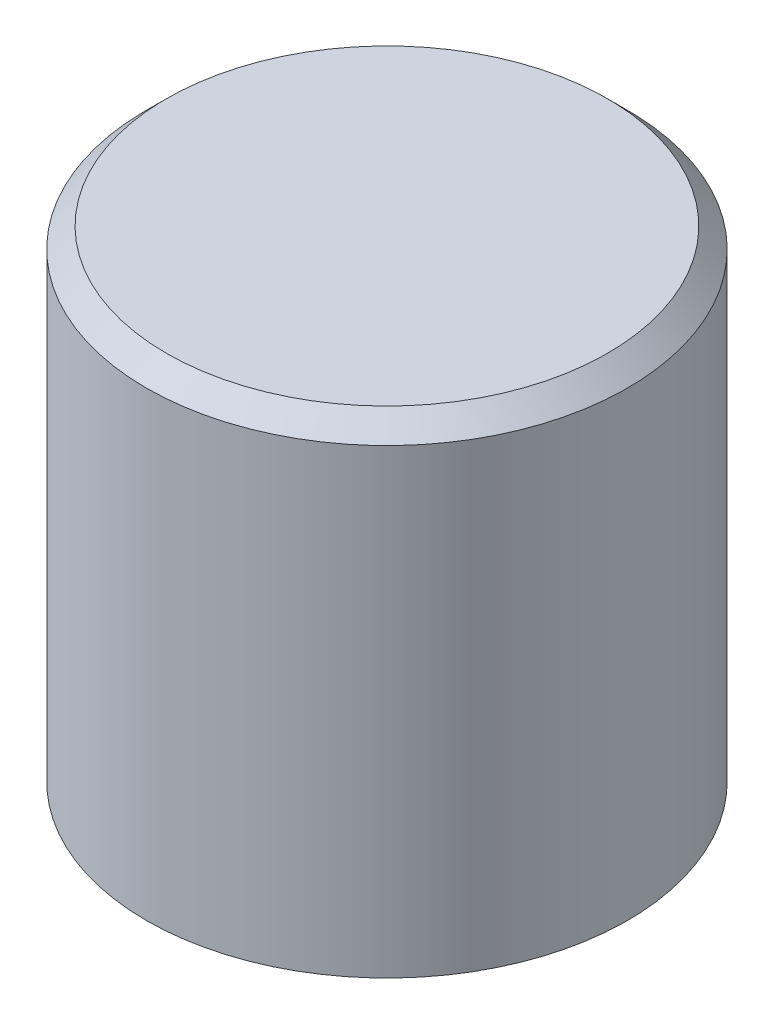
ISO-10303-21;
HEADER;
FILE_DESCRIPTION(('STEP AP214'),'2;1');
FILE_NAME('part.step','',(''),(''),'','','');
FILE_SCHEMA(('AUTOMOTIVE_DESIGN { 1 0 10303 214 1 1 1 1 }'));
ENDSEC;
DATA;
#1=APPLICATION_CONTEXT('core data for automotive mechanical design processes');
#2=APPLICATION_PROTOCOL_DEFINITION('international standard','automotive_design',2000,#1);
#3=PRODUCT_CONTEXT('',#1,'mechanical');
#4=PRODUCT('Part','Part','',(#3));
#5=PRODUCT_RELATED_PRODUCT_CATEGORY('part','',(#4));
#6=PRODUCT_DEFINITION_FORMATION('','',#4);
#7=PRODUCT_DEFINITION_CONTEXT('part definition',#1,'design');
#8=PRODUCT_DEFINITION('design','',#6,#7);
#9=PRODUCT_DEFINITION_SHAPE('','',#8);
#10=(LENGTH_UNIT() NAMED_UNIT(*) SI_UNIT(.MILLI.,.METRE.));
#11=(NAMED_UNIT(*) PLANE_ANGLE_UNIT() SI_UNIT($,.RADIAN.));
#12=(NAMED_UNIT(*) SI_UNIT($,.STERADIAN.) SOLID_ANGLE_UNIT());
#13=UNCERTAINTY_MEASURE_WITH_UNIT(LENGTH_MEASURE(1.E-05),#10,'distance_accuracy_value','');
#14=(GEOMETRIC_REPRESENTATION_CONTEXT(3) GLOBAL_UNCERTAINTY_ASSIGNED_CONTEXT((#13)) GLOBAL_UNIT_ASSIGNED_CONTEXT((#10,
#11,#12)) REPRESENTATION_CONTEXT('',''));
#15=CARTESIAN_POINT('',(0.,0.,0.));
#16=DIRECTION('',(0.,0.,1.));
#17=DIRECTION('',(1.,0.,0.));
#18=AXIS2_PLACEMENT_3D('',#15,#16,#17);
#19=CARTESIAN_POINT('',(0.,12.,0.));
#20=DIRECTION('',(0.,-1.,0.));
#21=DIRECTION('',(0.,0.,-1.));
#22=AXIS2_PLACEMENT_3D('',#19,#20,#21);
#23=CYLINDRICAL_SURFACE('',#22,6.);
#24=CARTESIAN_POINT('',(0.,11.5,0.));
#25=DIRECTION('',(0.,1.,0.));
#26=DIRECTION('',(0.,0.,1.));
#27=AXIS2_PLACEMENT_3D('',#24,#25,#26);
#28=CIRCLE('',#27,6.);
#29=CARTESIAN_POINT('',(0.,11.5,6.));
#30=VERTEX_POINT('',#29);
#31=EDGE_CURVE('E10',#30,#30,#28,.F.);
#32=ORIENTED_EDGE('',*,*,#31,.T.);
#33=EDGE_LOOP('',(#32));
#34=FACE_BOUND('',#33,.T.);
#35=CARTESIAN_POINT('',(0.,0.,0.));
#36=DIRECTION('',(0.,1.,0.));
#37=DIRECTION('',(0.,0.,1.));
#38=AXIS2_PLACEMENT_3D('',#35,#36,#37);
#39=CIRCLE('',#38,6.);
#40=CARTESIAN_POINT('',(0.,0.,6.));
#41=VERTEX_POINT('',#40);
#42=EDGE_CURVE('E54',#41,#41,#39,.T.);
#43=ORIENTED_EDGE('',*,*,#42,.T.);
#44=EDGE_LOOP('',(#43));
#45=FACE_BOUND('',#44,.T.);
#46=ADVANCED_FACE('F33',(#34,#45),#23,.T.);
#47=CARTESIAN_POINT('',(0.,12.,0.));
#48=DIRECTION('',(0.,1.,0.));
#49=DIRECTION('',(0.,0.,1.));
#50=AXIS2_PLACEMENT_3D('',#47,#48,#49);
#51=PLANE('',#50);
#52=CARTESIAN_POINT('',(0.,12.,0.));
#53=DIRECTION('',(0.,1.,0.));
#54=DIRECTION('',(0.,0.,1.));
#55=AXIS2_PLACEMENT_3D('',#52,#53,#54);
#56=CIRCLE('',#55,5.5);
#57=CARTESIAN_POINT('',(0.,12.,5.5));
#58=VERTEX_POINT('',#57);
#59=EDGE_CURVE('E41',#58,#58,#56,.T.);
#60=ORIENTED_EDGE('',*,*,#59,.T.);
#61=EDGE_LOOP('',(#60));
#62=FACE_BOUND('',#61,.T.);
#63=ADVANCED_FACE('F84',(#62),#51,.T.);
#64=CARTESIAN_POINT('',(0.,0.,0.));
#65=DIRECTION('',(0.,1.,0.));
#66=DIRECTION('',(0.,0.,1.));
#67=AXIS2_PLACEMENT_3D('',#64,#65,#66);
#68=PLANE('',#67);
#69=CARTESIAN_POINT('',(0.,0.,0.));
#70=DIRECTION('',(0.,-1.,0.));
#71=DIRECTION('',(0.,0.,-1.));
#72=AXIS2_PLACEMENT_3D('',#69,#70,#71);
#73=CIRCLE('',#72,5.);
#74=CARTESIAN_POINT('',(0.,0.,-5.));
#75=VERTEX_POINT('',#74);
#76=EDGE_CURVE('E57',#75,#75,#73,.T.);
#77=ORIENTED_EDGE('',*,*,#76,.F.);
#78=EDGE_LOOP('',(#77));
#79=FACE_BOUND('',#78,.T.);
#80=ORIENTED_EDGE('',*,*,#42,.F.);
#81=EDGE_LOOP('',(#80));
#82=FACE_BOUND('',#81,.T.);
#83=ADVANCED_FACE('F89',(#79,#82),#68,.F.);
#84=CARTESIAN_POINT('',(0.,0.,0.));
#85=DIRECTION('',(0.,-1.,0.));
#86=DIRECTION('',(0.,0.,-1.));
#87=AXIS2_PLACEMENT_3D('',#84,#85,#86);
#88=CYLINDRICAL_SURFACE('',#87,5.);
#89=ORIENTED_EDGE('',*,*,#76,.T.);
#90=EDGE_LOOP('',(#89));
#91=FACE_BOUND('',#90,.T.);
#92=CARTESIAN_POINT('',(0.,3.5,0.));
#93=DIRECTION('',(0.,-1.,0.));
#94=DIRECTION('',(0.,0.,-1.));
#95=AXIS2_PLACEMENT_3D('',#92,#93,#94);
#96=CIRCLE('',#95,5.);
#97=CARTESIAN_POINT('',(0.,3.5,-5.));
#98=VERTEX_POINT('',#97);
#99=EDGE_CURVE('E60',#98,#98,#96,.T.);
#100=ORIENTED_EDGE('',*,*,#99,.F.);
#101=EDGE_LOOP('',(#100));
#102=FACE_BOUND('',#101,.T.);
#103=ADVANCED_FACE('F80',(#91,#102),#88,.F.);
#104=CARTESIAN_POINT('',(0.,4.11714443247962,0.));
#105=DIRECTION('',(0.,-1.,0.));
#106=DIRECTION('',(0.,0.,-1.));
#107=AXIS2_PLACEMENT_3D('',#104,#105,#106);
#108=CONICAL_SURFACE('',#107,1.5,1.39626340159547);
#109=CARTESIAN_POINT('',(0.,4.09977961471292,0.));
#110=DIRECTION('',(0.,1.,0.));
#111=DIRECTION('',(0.,0.,1.));
#112=AXIS2_PLACEMENT_3D('',#109,#110,#111);
#113=CIRCLE('',#112,1.59848077530122);
#114=CARTESIAN_POINT('',(0.,4.09977961471292,-1.59848077530122));
#115=VERTEX_POINT('',#114);
#116=EDGE_CURVE('E45',#115,#115,#113,.T.);
#117=CARTESIAN_POINT('',(0.,4.09977961471292,-1.59848077530122));
#118=CARTESIAN_POINT('',(0.,4.093531910393,-1.63391326722517));
#119=CARTESIAN_POINT('',(0.,4.08728420607307,-1.66934575914911));
#120=CARTESIAN_POINT('',(0.,4.07478879743322,-1.74021074299701));
#121=CARTESIAN_POINT('',(0.,4.06854109311329,-1.77564323492095));
#122=CARTESIAN_POINT('',(0.,4.05604568447344,-1.84650821876884));
#123=CARTESIAN_POINT('',(0.,4.04979798015351,-1.88194071069279));
#124=CARTESIAN_POINT('',(0.,4.03730257151366,-1.95280569454068));
#125=CARTESIAN_POINT('',(0.,4.03105486719373,-1.98823818646462));
#126=CARTESIAN_POINT('',(0.,4.01855945855388,-2.05910317031252));
#127=CARTESIAN_POINT('',(0.,4.01231175423395,-2.09453566223646));
#128=CARTESIAN_POINT('',(0.,3.9998163455941,-2.16540064608435));
#129=CARTESIAN_POINT('',(0.,3.99356864127418,-2.2008331380083));
#130=CARTESIAN_POINT('',(0.,3.98107323263432,-2.27169812185619));
#131=CARTESIAN_POINT('',(0.,3.9748255283144,-2.30713061378014));
#132=CARTESIAN_POINT('',(0.,3.96233011967454,-2.37799559762803));
#133=CARTESIAN_POINT('',(0.,3.95608241535462,-2.41342808955197));
#134=CARTESIAN_POINT('',(0.,3.94358700671477,-2.48429307339986));
#135=CARTESIAN_POINT('',(0.,3.93733930239484,-2.51972556532381));
#136=CARTESIAN_POINT('',(0.,3.92484389375499,-2.5905905491717));
#137=CARTESIAN_POINT('',(0.,3.91859618943506,-2.62602304109564));
#138=CARTESIAN_POINT('',(0.,3.90610078079521,-2.69688802494354));
#139=CARTESIAN_POINT('',(0.,3.89985307647528,-2.73232051686748));
#140=CARTESIAN_POINT('',(0.,3.88735766783543,-2.80318550071537));
#141=CARTESIAN_POINT('',(0.,3.8811099635155,-2.83861799263932));
#142=CARTESIAN_POINT('',(0.,3.86861455487565,-2.90948297648721));
#143=CARTESIAN_POINT('',(0.,3.86236685055572,-2.94491546841116));
#144=CARTESIAN_POINT('',(0.,3.84987144191587,-3.01578045225905));
#145=CARTESIAN_POINT('',(0.,3.84362373759595,-3.05121294418299));
#146=CARTESIAN_POINT('',(0.,3.83112832895609,-3.12207792803088));
#147=CARTESIAN_POINT('',(0.,3.82488062463617,-3.15751041995483));
#148=CARTESIAN_POINT('',(0.,3.81238521599631,-3.22837540380272));
#149=CARTESIAN_POINT('',(0.,3.80613751167639,-3.26380789572667));
#150=CARTESIAN_POINT('',(0.,3.79364210303654,-3.33467287957456));
#151=CARTESIAN_POINT('',(0.,3.78739439871661,-3.3701053714985));
#152=CARTESIAN_POINT('',(0.,3.77489899007676,-3.44097035534639));
#153=CARTESIAN_POINT('',(0.,3.76865128575683,-3.47640284727034));
#154=CARTESIAN_POINT('',(0.,3.75615587711698,-3.54726783111823));
#155=CARTESIAN_POINT('',(0.,3.74990817279705,-3.58270032304218));
#156=CARTESIAN_POINT('',(0.,3.7374127641572,-3.65356530689007));
#157=CARTESIAN_POINT('',(0.,3.73116505983727,-3.68899779881401));
#158=CARTESIAN_POINT('',(0.,3.71866965119742,-3.7598627826619));
#159=CARTESIAN_POINT('',(0.,3.71242194687749,-3.79529527458585));
#160=CARTESIAN_POINT('',(0.,3.69992653823764,-3.86616025843374));
#161=CARTESIAN_POINT('',(0.,3.69367883391771,-3.90159275035769));
#162=CARTESIAN_POINT('',(0.,3.68118342527786,-3.97245773420558));
#163=CARTESIAN_POINT('',(0.,3.67493572095794,-4.00789022612952));
#164=CARTESIAN_POINT('',(0.,3.66244031231808,-4.07875520997741));
#165=CARTESIAN_POINT('',(0.,3.65619260799816,-4.11418770190136));
#166=CARTESIAN_POINT('',(0.,3.6436971993583,-4.18505268574925));
#167=CARTESIAN_POINT('',(0.,3.63744949503838,-4.2204851776732));
#168=CARTESIAN_POINT('',(0.,3.62495408639853,-4.29135016152109));
#169=CARTESIAN_POINT('',(0.,3.6187063820786,-4.32678265344503));
#170=CARTESIAN_POINT('',(0.,3.60621097343875,-4.39764763729292));
#171=CARTESIAN_POINT('',(0.,3.59996326911882,-4.43308012921687));
#172=CARTESIAN_POINT('',(0.,3.58746786047897,-4.50394511306476));
#173=CARTESIAN_POINT('',(0.,3.58122015615904,-4.53937760498871));
#174=CARTESIAN_POINT('',(0.,3.56872474751919,-4.6102425888366));
#175=CARTESIAN_POINT('',(0.,3.56247704319926,-4.64567508076054));
#176=CARTESIAN_POINT('',(0.,3.54998163455941,-4.71654006460843));
#177=CARTESIAN_POINT('',(0.,3.54373393023948,-4.75197255653238));
#178=CARTESIAN_POINT('',(0.,3.53123852159963,-4.82283754038027));
#179=CARTESIAN_POINT('',(0.,3.5249908172797,-4.85827003230422));
#180=CARTESIAN_POINT('',(0.,3.51249540863985,-4.92913501615211));
#181=CARTESIAN_POINT('',(0.,3.50624770431993,-4.96456750807605));
#182=CARTESIAN_POINT('',(0.,3.5,-5.));
#183=B_SPLINE_CURVE_WITH_KNOTS('',3,(#117,#118,#119,#120,#121,#122,#123,#124,#125,#126,#127,
#128,#129,#130,#131,#132,#133,#134,#135,#136,#137,#138,#139,#140,#141,#142,#143,#144,#145,#146,
#147,#148,#149,#150,#151,#152,#153,#154,#155,#156,#157,#158,#159,#160,#161,#162,#163,#164,#165,
#166,#167,#168,#169,#170,#171,#172,#173,#174,#175,#176,#177,#178,#179,#180,#181,#182),
.UNSPECIFIED.,.F.,.F.,(4,2,2,2,2,2,2,2,2,2,2,2,2,2,2,2,2,2,2,2,2,2,2,2,2,2,2,2,2,2,2,2,4),(0.,
0.107937285675003,0.215874571350006,0.323811857025009,0.431749142700012,0.539686428375016,
0.647623714050019,0.755560999725022,0.863498285400025,0.971435571075028,1.07937285675003,
1.18731014242503,1.29524742810004,1.40318471377504,1.51112199945004,1.61905928512505,
1.72699657080005,1.83493385647505,1.94287114215006,2.05080842782506,2.15874571350006,
2.26668299917507,2.37462028485007,2.48255757052507,2.59049485620008,2.69843214187508,
2.80636942755008,2.91430671322509,3.02224399890009,3.13018128457509,3.2381185702501,
3.3460558559251,3.4539931416001),.UNSPECIFIED.);
#184=EDGE_CURVE('BSEAM71',#115,#98,#183,.T.);
#185=ORIENTED_EDGE('',*,*,#116,.T.);
#186=ORIENTED_EDGE('',*,*,#99,.T.);
#187=ORIENTED_EDGE('',*,*,#184,.T.);
#188=ORIENTED_EDGE('',*,*,#184,.F.);
#189=EDGE_LOOP('',(#185,#187,#186,#188));
#190=FACE_BOUND('',#189,.T.);
#191=ADVANCED_FACE('F71',(#190),#108,.F.);
#192=CARTESIAN_POINT('',(0.,0.,0.));
#193=DIRECTION('',(0.,-1.,0.));
#194=DIRECTION('',(0.,0.,-1.));
#195=AXIS2_PLACEMENT_3D('',#192,#193,#194);
#196=CYLINDRICAL_SURFACE('',#195,1.5);
#197=CARTESIAN_POINT('',(0.,4.24042473766178,0.));
#198=DIRECTION('',(0.,-1.,0.));
#199=DIRECTION('',(0.,0.,-1.));
#200=AXIS2_PLACEMENT_3D('',#197,#198,#199);
#201=CIRCLE('',#200,1.5);
#202=CARTESIAN_POINT('',(0.,4.24042473766178,-1.5));
#203=VERTEX_POINT('',#202);
#204=EDGE_CURVE('E49',#203,#203,#201,.T.);
#205=ORIENTED_EDGE('',*,*,#204,.T.);
#206=EDGE_LOOP('',(#205));
#207=FACE_BOUND('',#206,.T.);
#208=CARTESIAN_POINT('',(0.,8.5,0.));
#209=DIRECTION('',(0.,-1.,0.));
#210=DIRECTION('',(0.,0.,-1.));
#211=AXIS2_PLACEMENT_3D('',#208,#209,#210);
#212=CIRCLE('',#211,1.5);
#213=CARTESIAN_POINT('',(0.,8.5,-1.5));
#214=VERTEX_POINT('',#213);
#215=EDGE_CURVE('E63',#214,#214,#212,.T.);
#216=ORIENTED_EDGE('',*,*,#215,.F.);
#217=EDGE_LOOP('',(#216));
#218=FACE_BOUND('',#217,.T.);
#219=ADVANCED_FACE('F69',(#207,#218),#196,.F.);
#220=CARTESIAN_POINT('',(0.,8.5,0.));
#221=DIRECTION('',(0.,-1.,0.));
#222=DIRECTION('',(0.,0.,-1.));
#223=AXIS2_PLACEMENT_3D('',#220,#221,#222);
#224=PLANE('',#223);
#225=ORIENTED_EDGE('',*,*,#215,.T.);
#226=EDGE_LOOP('',(#225));
#227=FACE_BOUND('',#226,.T.);
#228=ADVANCED_FACE('F67',(#227),#224,.T.);
#229=CARTESIAN_POINT('',(0.,4.24042473766178,0.));
#230=DIRECTION('',(0.,-1.,0.));
#231=DIRECTION('',(0.,0.,-1.));
#232=AXIS2_PLACEMENT_3D('',#229,#230,#231);
#233=CONICAL_SURFACE('',#232,1.5,0.610865238198009);
#234=ORIENTED_EDGE('',*,*,#116,.F.);
#235=EDGE_LOOP('',(#234));
#236=FACE_BOUND('',#235,.T.);
#237=ORIENTED_EDGE('',*,*,#204,.F.);
#238=EDGE_LOOP('',(#237));
#239=FACE_BOUND('',#238,.T.);
#240=ADVANCED_FACE('F78',(#236,#239),#233,.F.);
#241=CARTESIAN_POINT('',(0.,12.,0.));
#242=DIRECTION('',(0.,-1.,0.));
#243=DIRECTION('',(0.,0.,-1.));
#244=AXIS2_PLACEMENT_3D('',#241,#242,#243);
#245=CONICAL_SURFACE('',#244,5.5,0.785398163397447);
#246=ORIENTED_EDGE('',*,*,#31,.F.);
#247=EDGE_LOOP('',(#246));
#248=FACE_BOUND('',#247,.T.);
#249=ORIENTED_EDGE('',*,*,#59,.F.);
#250=EDGE_LOOP('',(#249));
#251=FACE_BOUND('',#250,.T.);
#252=ADVANCED_FACE('F36',(#248,#251),#245,.T.);
#253=CLOSED_SHELL('',(#46,#63,#83,#103,#191,#219,#228,#240,#252));
#254=MANIFOLD_SOLID_BREP('B2',#253);
#255=ADVANCED_BREP_SHAPE_REPRESENTATION('',(#18,#254),#14);
#256=SHAPE_DEFINITION_REPRESENTATION(#9,#255);
ENDSEC;
END-ISO-10303-21;
